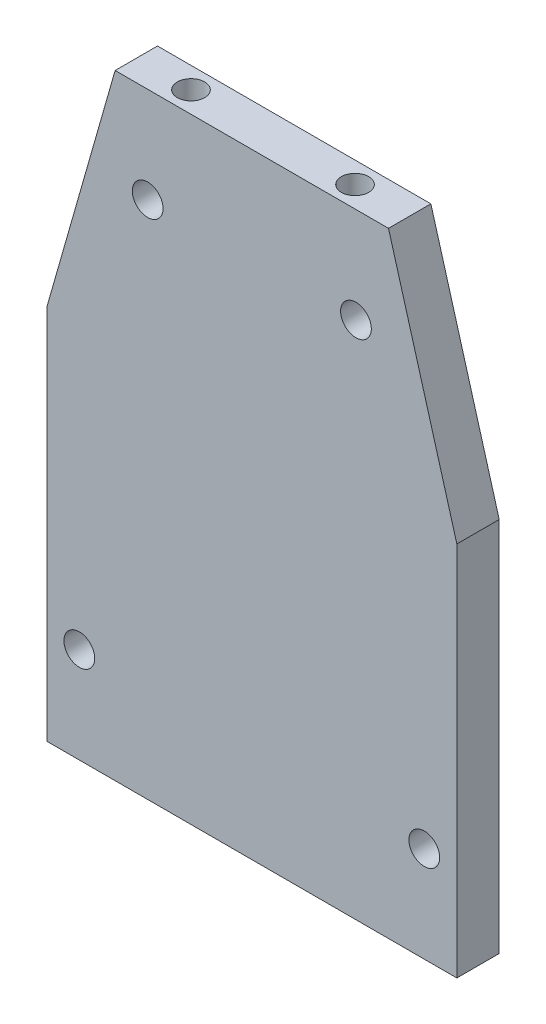
ISO-10303-21;
HEADER;
FILE_DESCRIPTION(('STEP AP214'),'2;1');
FILE_NAME('part.step','',(''),(''),'','','');
FILE_SCHEMA(('AUTOMOTIVE_DESIGN { 1 0 10303 214 1 1 1 1 }'));
ENDSEC;
DATA;
#1=APPLICATION_CONTEXT('core data for automotive mechanical design processes');
#2=APPLICATION_PROTOCOL_DEFINITION('international standard','automotive_design',2000,#1);
#3=PRODUCT_CONTEXT('',#1,'mechanical');
#4=PRODUCT('Part','Part','',(#3));
#5=PRODUCT_RELATED_PRODUCT_CATEGORY('part','',(#4));
#6=PRODUCT_DEFINITION_FORMATION('','',#4);
#7=PRODUCT_DEFINITION_CONTEXT('part definition',#1,'design');
#8=PRODUCT_DEFINITION('design','',#6,#7);
#9=PRODUCT_DEFINITION_SHAPE('','',#8);
#10=(LENGTH_UNIT() NAMED_UNIT(*) SI_UNIT(.MILLI.,.METRE.));
#11=(NAMED_UNIT(*) PLANE_ANGLE_UNIT() SI_UNIT($,.RADIAN.));
#12=(NAMED_UNIT(*) SI_UNIT($,.STERADIAN.) SOLID_ANGLE_UNIT());
#13=UNCERTAINTY_MEASURE_WITH_UNIT(LENGTH_MEASURE(1.E-05),#10,'distance_accuracy_value','');
#14=(GEOMETRIC_REPRESENTATION_CONTEXT(3) GLOBAL_UNCERTAINTY_ASSIGNED_CONTEXT((#13)) GLOBAL_UNIT_ASSIGNED_CONTEXT((#10,
#11,#12)) REPRESENTATION_CONTEXT('',''));
#15=CARTESIAN_POINT('',(0.,0.,0.));
#16=DIRECTION('',(0.,0.,1.));
#17=DIRECTION('',(1.,0.,0.));
#18=AXIS2_PLACEMENT_3D('',#15,#16,#17);
#19=CARTESIAN_POINT('',(-20.,45.,3.1));
#20=DIRECTION('',(0.961523947640823,-0.274721127897378,0.));
#21=DIRECTION('',(0.274721127897378,0.961523947640823,0.));
#22=AXIS2_PLACEMENT_3D('',#19,#20,#21);
#23=PLANE('',#22);
#24=DIRECTION('',(-0.274721127897378,-0.961523947640823,0.));
#25=VECTOR('',#24,1.);
#26=CARTESIAN_POINT('',(-20.,45.,-3.1));
#27=LINE('',#26,#25);
#28=CARTESIAN_POINT('',(-20.,45.,-3.1));
#29=VERTEX_POINT('',#28);
#30=CARTESIAN_POINT('',(-30.,9.99999999999999,-3.1));
#31=VERTEX_POINT('',#30);
#32=EDGE_CURVE('E117',#29,#31,#27,.T.);
#33=ORIENTED_EDGE('',*,*,#32,.T.);
#34=DIRECTION('',(0.,0.,-1.));
#35=VECTOR('',#34,1.);
#36=CARTESIAN_POINT('',(-30.,9.99999999999999,3.1));
#37=LINE('',#36,#35);
#38=CARTESIAN_POINT('',(-30.,9.99999999999999,3.1));
#39=VERTEX_POINT('',#38);
#40=EDGE_CURVE('E11',#39,#31,#37,.T.);
#41=ORIENTED_EDGE('',*,*,#40,.F.);
#42=DIRECTION('',(-0.274721127897378,-0.961523947640823,0.));
#43=VECTOR('',#42,1.);
#44=CARTESIAN_POINT('',(-20.,45.,3.1));
#45=LINE('',#44,#43);
#46=CARTESIAN_POINT('',(-20.,45.,3.1));
#47=VERTEX_POINT('',#46);
#48=EDGE_CURVE('E128',#47,#39,#45,.T.);
#49=ORIENTED_EDGE('',*,*,#48,.F.);
#50=DIRECTION('',(0.,0.,-1.));
#51=VECTOR('',#50,1.);
#52=CARTESIAN_POINT('',(-20.,45.,3.1));
#53=LINE('',#52,#51);
#54=EDGE_CURVE('E113',#47,#29,#53,.T.);
#55=ORIENTED_EDGE('',*,*,#54,.T.);
#56=EDGE_LOOP('',(#33,#41,#49,#55));
#57=FACE_BOUND('',#56,.T.);
#58=ADVANCED_FACE('F33',(#57),#23,.F.);
#59=CARTESIAN_POINT('',(-30.,9.99999999999999,3.1));
#60=DIRECTION('',(1.,0.,0.));
#61=DIRECTION('',(0.,1.,0.));
#62=AXIS2_PLACEMENT_3D('',#59,#60,#61);
#63=PLANE('',#62);
#64=DIRECTION('',(0.,-1.,0.));
#65=VECTOR('',#64,1.);
#66=CARTESIAN_POINT('',(-30.,9.99999999999999,-3.1));
#67=LINE('',#66,#65);
#68=CARTESIAN_POINT('',(-30.,-45.,-3.1));
#69=VERTEX_POINT('',#68);
#70=EDGE_CURVE('E120',#31,#69,#67,.T.);
#71=ORIENTED_EDGE('',*,*,#70,.T.);
#72=DIRECTION('',(0.,0.,-1.));
#73=VECTOR('',#72,1.);
#74=CARTESIAN_POINT('',(-30.,-45.,3.1));
#75=LINE('',#74,#73);
#76=CARTESIAN_POINT('',(-30.,-45.,3.1));
#77=VERTEX_POINT('',#76);
#78=EDGE_CURVE('E41',#77,#69,#75,.T.);
#79=ORIENTED_EDGE('',*,*,#78,.F.);
#80=DIRECTION('',(0.,-1.,0.));
#81=VECTOR('',#80,1.);
#82=CARTESIAN_POINT('',(-30.,9.99999999999999,3.1));
#83=LINE('',#82,#81);
#84=EDGE_CURVE('E86',#39,#77,#83,.T.);
#85=ORIENTED_EDGE('',*,*,#84,.F.);
#86=ORIENTED_EDGE('',*,*,#40,.T.);
#87=EDGE_LOOP('',(#71,#79,#85,#86));
#88=FACE_BOUND('',#87,.T.);
#89=ADVANCED_FACE('F156',(#88),#63,.F.);
#90=CARTESIAN_POINT('',(-30.,-45.,3.1));
#91=DIRECTION('',(0.,1.,0.));
#92=DIRECTION('',(-1.,0.,0.));
#93=AXIS2_PLACEMENT_3D('',#90,#91,#92);
#94=PLANE('',#93);
#95=CARTESIAN_POINT('',(20.,-45.,0.));
#96=DIRECTION('',(0.,-1.,0.));
#97=DIRECTION('',(1.,0.,0.));
#98=AXIS2_PLACEMENT_3D('',#95,#96,#97);
#99=CIRCLE('',#98,2.);
#100=CARTESIAN_POINT('',(22.,-45.,0.));
#101=VERTEX_POINT('',#100);
#102=EDGE_CURVE('E375',#101,#101,#99,.T.);
#103=ORIENTED_EDGE('',*,*,#102,.F.);
#104=EDGE_LOOP('',(#103));
#105=FACE_BOUND('',#104,.T.);
#106=CARTESIAN_POINT('',(-20.,-45.,0.));
#107=DIRECTION('',(0.,-1.,0.));
#108=DIRECTION('',(-1.,0.,0.));
#109=AXIS2_PLACEMENT_3D('',#106,#107,#108);
#110=CIRCLE('',#109,2.);
#111=CARTESIAN_POINT('',(-22.,-45.,0.));
#112=VERTEX_POINT('',#111);
#113=EDGE_CURVE('E381',#112,#112,#110,.T.);
#114=ORIENTED_EDGE('',*,*,#113,.F.);
#115=EDGE_LOOP('',(#114));
#116=FACE_BOUND('',#115,.T.);
#117=CARTESIAN_POINT('',(0.,-45.,0.));
#118=DIRECTION('',(0.,-1.,0.));
#119=DIRECTION('',(1.,0.,0.));
#120=AXIS2_PLACEMENT_3D('',#117,#118,#119);
#121=CIRCLE('',#120,2.);
#122=CARTESIAN_POINT('',(2.,-45.,0.));
#123=VERTEX_POINT('',#122);
#124=EDGE_CURVE('E351',#123,#123,#121,.T.);
#125=ORIENTED_EDGE('',*,*,#124,.F.);
#126=EDGE_LOOP('',(#125));
#127=FACE_BOUND('',#126,.T.);
#128=DIRECTION('',(1.,0.,0.));
#129=VECTOR('',#128,1.);
#130=CARTESIAN_POINT('',(-30.,-45.,-3.1));
#131=LINE('',#130,#129);
#132=CARTESIAN_POINT('',(30.,-45.,-3.1));
#133=VERTEX_POINT('',#132);
#134=EDGE_CURVE('E123',#69,#133,#131,.T.);
#135=ORIENTED_EDGE('',*,*,#134,.T.);
#136=DIRECTION('',(0.,0.,-1.));
#137=VECTOR('',#136,1.);
#138=CARTESIAN_POINT('',(30.,-45.,3.1));
#139=LINE('',#138,#137);
#140=CARTESIAN_POINT('',(30.,-45.,3.1));
#141=VERTEX_POINT('',#140);
#142=EDGE_CURVE('E108',#141,#133,#139,.T.);
#143=ORIENTED_EDGE('',*,*,#142,.F.);
#144=DIRECTION('',(1.,0.,0.));
#145=VECTOR('',#144,1.);
#146=CARTESIAN_POINT('',(-30.,-45.,3.1));
#147=LINE('',#146,#145);
#148=EDGE_CURVE('E99',#77,#141,#147,.T.);
#149=ORIENTED_EDGE('',*,*,#148,.F.);
#150=ORIENTED_EDGE('',*,*,#78,.T.);
#151=EDGE_LOOP('',(#135,#143,#149,#150));
#152=FACE_BOUND('',#151,.T.);
#153=ADVANCED_FACE('F134',(#105,#116,#127,#152),#94,.F.);
#154=CARTESIAN_POINT('',(30.,10.,3.1));
#155=DIRECTION('',(-1.,0.,0.));
#156=DIRECTION('',(0.,-1.,0.));
#157=AXIS2_PLACEMENT_3D('',#154,#155,#156);
#158=PLANE('',#157);
#159=DIRECTION('',(0.,1.,0.));
#160=VECTOR('',#159,1.);
#161=CARTESIAN_POINT('',(30.,10.,-3.1));
#162=LINE('',#161,#160);
#163=CARTESIAN_POINT('',(30.,10.,-3.1));
#164=VERTEX_POINT('',#163);
#165=EDGE_CURVE('E107',#133,#164,#162,.T.);
#166=ORIENTED_EDGE('',*,*,#165,.T.);
#167=DIRECTION('',(0.,0.,-1.));
#168=VECTOR('',#167,1.);
#169=CARTESIAN_POINT('',(30.,10.,3.1));
#170=LINE('',#169,#168);
#171=CARTESIAN_POINT('',(30.,10.,3.1));
#172=VERTEX_POINT('',#171);
#173=EDGE_CURVE('E104',#172,#164,#170,.T.);
#174=ORIENTED_EDGE('',*,*,#173,.F.);
#175=DIRECTION('',(0.,1.,0.));
#176=VECTOR('',#175,1.);
#177=CARTESIAN_POINT('',(30.,10.,3.1));
#178=LINE('',#177,#176);
#179=EDGE_CURVE('E93',#141,#172,#178,.T.);
#180=ORIENTED_EDGE('',*,*,#179,.F.);
#181=ORIENTED_EDGE('',*,*,#142,.T.);
#182=EDGE_LOOP('',(#166,#174,#180,#181));
#183=FACE_BOUND('',#182,.T.);
#184=ADVANCED_FACE('F105',(#183),#158,.F.);
#185=CARTESIAN_POINT('',(20.,45.,3.1));
#186=DIRECTION('',(-0.961523947640823,-0.274721127897379,0.));
#187=DIRECTION('',(0.274721127897379,-0.961523947640823,0.));
#188=AXIS2_PLACEMENT_3D('',#185,#186,#187);
#189=PLANE('',#188);
#190=DIRECTION('',(-0.274721127897379,0.961523947640823,0.));
#191=VECTOR('',#190,1.);
#192=CARTESIAN_POINT('',(20.,45.,-3.1));
#193=LINE('',#192,#191);
#194=CARTESIAN_POINT('',(20.,45.,-3.1));
#195=VERTEX_POINT('',#194);
#196=EDGE_CURVE('E72',#164,#195,#193,.T.);
#197=ORIENTED_EDGE('',*,*,#196,.T.);
#198=DIRECTION('',(0.,0.,-1.));
#199=VECTOR('',#198,1.);
#200=CARTESIAN_POINT('',(20.,45.,3.1));
#201=LINE('',#200,#199);
#202=CARTESIAN_POINT('',(20.,45.,3.1));
#203=VERTEX_POINT('',#202);
#204=EDGE_CURVE('E109',#203,#195,#201,.T.);
#205=ORIENTED_EDGE('',*,*,#204,.F.);
#206=DIRECTION('',(-0.274721127897379,0.961523947640823,0.));
#207=VECTOR('',#206,1.);
#208=CARTESIAN_POINT('',(20.,45.,3.1));
#209=LINE('',#208,#207);
#210=EDGE_CURVE('E97',#172,#203,#209,.T.);
#211=ORIENTED_EDGE('',*,*,#210,.F.);
#212=ORIENTED_EDGE('',*,*,#173,.T.);
#213=EDGE_LOOP('',(#197,#205,#211,#212));
#214=FACE_BOUND('',#213,.T.);
#215=ADVANCED_FACE('F111',(#214),#189,.F.);
#216=CARTESIAN_POINT('',(-20.,45.,3.1));
#217=DIRECTION('',(0.,-1.,0.));
#218=DIRECTION('',(1.,0.,0.));
#219=AXIS2_PLACEMENT_3D('',#216,#217,#218);
#220=PLANE('',#219);
#221=CARTESIAN_POINT('',(-12.,45.,0.));
#222=DIRECTION('',(0.,1.,0.));
#223=DIRECTION('',(-1.,0.,0.));
#224=AXIS2_PLACEMENT_3D('',#221,#222,#223);
#225=CIRCLE('',#224,2.);
#226=CARTESIAN_POINT('',(-14.,45.,0.));
#227=VERTEX_POINT('',#226);
#228=EDGE_CURVE('E391',#227,#227,#225,.T.);
#229=ORIENTED_EDGE('',*,*,#228,.F.);
#230=EDGE_LOOP('',(#229));
#231=FACE_BOUND('',#230,.T.);
#232=CARTESIAN_POINT('',(12.,45.,0.));
#233=DIRECTION('',(0.,1.,0.));
#234=DIRECTION('',(1.,0.,0.));
#235=AXIS2_PLACEMENT_3D('',#232,#233,#234);
#236=CIRCLE('',#235,2.);
#237=CARTESIAN_POINT('',(14.,45.,0.));
#238=VERTEX_POINT('',#237);
#239=EDGE_CURVE('E374',#238,#238,#236,.T.);
#240=ORIENTED_EDGE('',*,*,#239,.F.);
#241=EDGE_LOOP('',(#240));
#242=FACE_BOUND('',#241,.T.);
#243=DIRECTION('',(-1.,0.,0.));
#244=VECTOR('',#243,1.);
#245=CARTESIAN_POINT('',(-20.,45.,-3.1));
#246=LINE('',#245,#244);
#247=EDGE_CURVE('E78',#195,#29,#246,.T.);
#248=ORIENTED_EDGE('',*,*,#247,.T.);
#249=ORIENTED_EDGE('',*,*,#54,.F.);
#250=DIRECTION('',(-1.,0.,0.));
#251=VECTOR('',#250,1.);
#252=CARTESIAN_POINT('',(-20.,45.,3.1));
#253=LINE('',#252,#251);
#254=EDGE_CURVE('E49',#203,#47,#253,.T.);
#255=ORIENTED_EDGE('',*,*,#254,.F.);
#256=ORIENTED_EDGE('',*,*,#204,.T.);
#257=EDGE_LOOP('',(#248,#249,#255,#256));
#258=FACE_BOUND('',#257,.T.);
#259=ADVANCED_FACE('F141',(#231,#242,#258),#220,.F.);
#260=CARTESIAN_POINT('',(0.,0.,3.1));
#261=DIRECTION('',(0.,0.,1.));
#262=DIRECTION('',(1.,0.,0.));
#263=AXIS2_PLACEMENT_3D('',#260,#261,#262);
#264=PLANE('',#263);
#265=CARTESIAN_POINT('',(-25.2375,-31.,3.1));
#266=DIRECTION('',(0.,0.,1.));
#267=DIRECTION('',(1.,0.,0.));
#268=AXIS2_PLACEMENT_3D('',#265,#266,#267);
#269=CIRCLE('',#268,2.25);
#270=CARTESIAN_POINT('',(-22.9875,-31.,3.1));
#271=VERTEX_POINT('',#270);
#272=EDGE_CURVE('E348',#271,#271,#269,.T.);
#273=ORIENTED_EDGE('',*,*,#272,.F.);
#274=EDGE_LOOP('',(#273));
#275=FACE_BOUND('',#274,.T.);
#276=CARTESIAN_POINT('',(15.2374999999996,31.,3.1));
#277=DIRECTION('',(0.,0.,1.));
#278=DIRECTION('',(-1.,0.,0.));
#279=AXIS2_PLACEMENT_3D('',#276,#277,#278);
#280=CIRCLE('',#279,2.25);
#281=CARTESIAN_POINT('',(12.9874999999996,31.,3.1));
#282=VERTEX_POINT('',#281);
#283=EDGE_CURVE('E357',#282,#282,#280,.T.);
#284=ORIENTED_EDGE('',*,*,#283,.F.);
#285=EDGE_LOOP('',(#284));
#286=FACE_BOUND('',#285,.T.);
#287=CARTESIAN_POINT('',(-15.2374999999996,31.,3.1));
#288=DIRECTION('',(0.,0.,1.));
#289=DIRECTION('',(1.,0.,0.));
#290=AXIS2_PLACEMENT_3D('',#287,#288,#289);
#291=CIRCLE('',#290,2.25);
#292=CARTESIAN_POINT('',(-12.9874999999996,31.,3.1));
#293=VERTEX_POINT('',#292);
#294=EDGE_CURVE('E363',#293,#293,#291,.T.);
#295=ORIENTED_EDGE('',*,*,#294,.F.);
#296=EDGE_LOOP('',(#295));
#297=FACE_BOUND('',#296,.T.);
#298=CARTESIAN_POINT('',(25.2375,-31.,3.1));
#299=DIRECTION('',(0.,0.,1.));
#300=DIRECTION('',(-1.,0.,0.));
#301=AXIS2_PLACEMENT_3D('',#298,#299,#300);
#302=CIRCLE('',#301,2.25);
#303=CARTESIAN_POINT('',(22.9875,-31.,3.1));
#304=VERTEX_POINT('',#303);
#305=EDGE_CURVE('E354',#304,#304,#302,.T.);
#306=ORIENTED_EDGE('',*,*,#305,.F.);
#307=EDGE_LOOP('',(#306));
#308=FACE_BOUND('',#307,.T.);
#309=ORIENTED_EDGE('',*,*,#48,.T.);
#310=ORIENTED_EDGE('',*,*,#84,.T.);
#311=ORIENTED_EDGE('',*,*,#148,.T.);
#312=ORIENTED_EDGE('',*,*,#179,.T.);
#313=ORIENTED_EDGE('',*,*,#210,.T.);
#314=ORIENTED_EDGE('',*,*,#254,.T.);
#315=EDGE_LOOP('',(#309,#310,#311,#312,#313,#314));
#316=FACE_BOUND('',#315,.T.);
#317=ADVANCED_FACE('F95',(#275,#286,#297,#308,#316),#264,.T.);
#318=CARTESIAN_POINT('',(0.,0.,-3.1));
#319=DIRECTION('',(0.,0.,1.));
#320=DIRECTION('',(1.,0.,0.));
#321=AXIS2_PLACEMENT_3D('',#318,#319,#320);
#322=PLANE('',#321);
#323=CARTESIAN_POINT('',(-25.2375,-31.,-3.1));
#324=DIRECTION('',(0.,0.,1.));
#325=DIRECTION('',(1.,0.,0.));
#326=AXIS2_PLACEMENT_3D('',#323,#324,#325);
#327=CIRCLE('',#326,2.25);
#328=CARTESIAN_POINT('',(-22.9875,-31.,-3.1));
#329=VERTEX_POINT('',#328);
#330=EDGE_CURVE('E345',#329,#329,#327,.F.);
#331=ORIENTED_EDGE('',*,*,#330,.F.);
#332=EDGE_LOOP('',(#331));
#333=FACE_BOUND('',#332,.T.);
#334=CARTESIAN_POINT('',(15.2374999999996,31.,-3.1));
#335=DIRECTION('',(0.,0.,1.));
#336=DIRECTION('',(1.,0.,0.));
#337=AXIS2_PLACEMENT_3D('',#334,#335,#336);
#338=CIRCLE('',#337,2.25);
#339=CARTESIAN_POINT('',(17.4874999999996,31.,-3.1));
#340=VERTEX_POINT('',#339);
#341=EDGE_CURVE('E360',#340,#340,#338,.F.);
#342=ORIENTED_EDGE('',*,*,#341,.F.);
#343=EDGE_LOOP('',(#342));
#344=FACE_BOUND('',#343,.T.);
#345=CARTESIAN_POINT('',(-15.2374999999996,31.,-3.1));
#346=DIRECTION('',(0.,0.,1.));
#347=DIRECTION('',(1.,0.,0.));
#348=AXIS2_PLACEMENT_3D('',#345,#346,#347);
#349=CIRCLE('',#348,2.25);
#350=CARTESIAN_POINT('',(-12.9874999999996,31.,-3.1));
#351=VERTEX_POINT('',#350);
#352=EDGE_CURVE('E365',#351,#351,#349,.F.);
#353=ORIENTED_EDGE('',*,*,#352,.F.);
#354=EDGE_LOOP('',(#353));
#355=FACE_BOUND('',#354,.T.);
#356=CARTESIAN_POINT('',(25.2375,-31.,-3.1));
#357=DIRECTION('',(0.,0.,1.));
#358=DIRECTION('',(1.,0.,0.));
#359=AXIS2_PLACEMENT_3D('',#356,#357,#358);
#360=CIRCLE('',#359,2.25);
#361=CARTESIAN_POINT('',(27.4875,-31.,-3.1));
#362=VERTEX_POINT('',#361);
#363=EDGE_CURVE('E349',#362,#362,#360,.F.);
#364=ORIENTED_EDGE('',*,*,#363,.F.);
#365=EDGE_LOOP('',(#364));
#366=FACE_BOUND('',#365,.T.);
#367=ORIENTED_EDGE('',*,*,#32,.F.);
#368=ORIENTED_EDGE('',*,*,#247,.F.);
#369=ORIENTED_EDGE('',*,*,#196,.F.);
#370=ORIENTED_EDGE('',*,*,#165,.F.);
#371=ORIENTED_EDGE('',*,*,#134,.F.);
#372=ORIENTED_EDGE('',*,*,#70,.F.);
#373=EDGE_LOOP('',(#367,#368,#369,#370,#371,#372));
#374=FACE_BOUND('',#373,.T.);
#375=ADVANCED_FACE('F137',(#333,#344,#355,#366,#374),#322,.F.);
#376=CARTESIAN_POINT('',(12.,37.,0.));
#377=DIRECTION('',(0.,1.,0.));
#378=DIRECTION('',(-1.,0.,0.));
#379=AXIS2_PLACEMENT_3D('',#376,#377,#378);
#380=CYLINDRICAL_SURFACE('',#379,2.);
#381=CARTESIAN_POINT('',(12.,37.,0.));
#382=DIRECTION('',(0.,1.,0.));
#383=DIRECTION('',(1.,0.,0.));
#384=AXIS2_PLACEMENT_3D('',#381,#382,#383);
#385=CIRCLE('',#384,2.);
#386=CARTESIAN_POINT('',(14.,37.,0.));
#387=VERTEX_POINT('',#386);
#388=EDGE_CURVE('E394',#387,#387,#385,.T.);
#389=ORIENTED_EDGE('',*,*,#388,.F.);
#390=EDGE_LOOP('',(#389));
#391=FACE_BOUND('',#390,.T.);
#392=ORIENTED_EDGE('',*,*,#239,.T.);
#393=EDGE_LOOP('',(#392));
#394=FACE_BOUND('',#393,.T.);
#395=ADVANCED_FACE('F185',(#391,#394),#380,.F.);
#396=CARTESIAN_POINT('',(12.,37.,0.));
#397=DIRECTION('',(0.,-1.,0.));
#398=DIRECTION('',(1.,0.,0.));
#399=AXIS2_PLACEMENT_3D('',#396,#397,#398);
#400=PLANE('',#399);
#401=ORIENTED_EDGE('',*,*,#388,.T.);
#402=EDGE_LOOP('',(#401));
#403=FACE_BOUND('',#402,.T.);
#404=ADVANCED_FACE('F190',(#403),#400,.F.);
#405=CARTESIAN_POINT('',(-12.,37.,0.));
#406=DIRECTION('',(0.,1.,0.));
#407=DIRECTION('',(-1.,0.,0.));
#408=AXIS2_PLACEMENT_3D('',#405,#406,#407);
#409=CYLINDRICAL_SURFACE('',#408,2.);
#410=CARTESIAN_POINT('',(-12.,37.,0.));
#411=DIRECTION('',(0.,1.,0.));
#412=DIRECTION('',(-1.,0.,0.));
#413=AXIS2_PLACEMENT_3D('',#410,#411,#412);
#414=CIRCLE('',#413,2.);
#415=CARTESIAN_POINT('',(-14.,37.,0.));
#416=VERTEX_POINT('',#415);
#417=EDGE_CURVE('E121',#416,#416,#414,.T.);
#418=ORIENTED_EDGE('',*,*,#417,.F.);
#419=EDGE_LOOP('',(#418));
#420=FACE_BOUND('',#419,.T.);
#421=ORIENTED_EDGE('',*,*,#228,.T.);
#422=EDGE_LOOP('',(#421));
#423=FACE_BOUND('',#422,.T.);
#424=ADVANCED_FACE('F202',(#420,#423),#409,.F.);
#425=CARTESIAN_POINT('',(-12.,37.,0.));
#426=DIRECTION('',(0.,1.,0.));
#427=DIRECTION('',(-1.,0.,0.));
#428=AXIS2_PLACEMENT_3D('',#425,#426,#427);
#429=PLANE('',#428);
#430=ORIENTED_EDGE('',*,*,#417,.T.);
#431=EDGE_LOOP('',(#430));
#432=FACE_BOUND('',#431,.T.);
#433=ADVANCED_FACE('F212',(#432),#429,.T.);
#434=CARTESIAN_POINT('',(0.,-37.,0.));
#435=DIRECTION('',(0.,-1.,0.));
#436=DIRECTION('',(1.,0.,0.));
#437=AXIS2_PLACEMENT_3D('',#434,#435,#436);
#438=CYLINDRICAL_SURFACE('',#437,2.);
#439=CARTESIAN_POINT('',(0.,-37.,0.));
#440=DIRECTION('',(0.,-1.,0.));
#441=DIRECTION('',(1.,0.,0.));
#442=AXIS2_PLACEMENT_3D('',#439,#440,#441);
#443=CIRCLE('',#442,2.);
#444=CARTESIAN_POINT('',(2.,-37.,0.));
#445=VERTEX_POINT('',#444);
#446=EDGE_CURVE('E384',#445,#445,#443,.T.);
#447=ORIENTED_EDGE('',*,*,#446,.F.);
#448=EDGE_LOOP('',(#447));
#449=FACE_BOUND('',#448,.T.);
#450=ORIENTED_EDGE('',*,*,#124,.T.);
#451=EDGE_LOOP('',(#450));
#452=FACE_BOUND('',#451,.T.);
#453=ADVANCED_FACE('F221',(#449,#452),#438,.F.);
#454=CARTESIAN_POINT('',(0.,-37.,0.));
#455=DIRECTION('',(0.,-1.,0.));
#456=DIRECTION('',(1.,0.,0.));
#457=AXIS2_PLACEMENT_3D('',#454,#455,#456);
#458=PLANE('',#457);
#459=ORIENTED_EDGE('',*,*,#446,.T.);
#460=EDGE_LOOP('',(#459));
#461=FACE_BOUND('',#460,.T.);
#462=ADVANCED_FACE('F237',(#461),#458,.T.);
#463=CARTESIAN_POINT('',(-20.,-37.,0.));
#464=DIRECTION('',(0.,-1.,0.));
#465=DIRECTION('',(1.,0.,0.));
#466=AXIS2_PLACEMENT_3D('',#463,#464,#465);
#467=CYLINDRICAL_SURFACE('',#466,2.);
#468=CARTESIAN_POINT('',(-20.,-37.,0.));
#469=DIRECTION('',(0.,-1.,0.));
#470=DIRECTION('',(-1.,0.,0.));
#471=AXIS2_PLACEMENT_3D('',#468,#469,#470);
#472=CIRCLE('',#471,2.);
#473=CARTESIAN_POINT('',(-22.,-37.,0.));
#474=VERTEX_POINT('',#473);
#475=EDGE_CURVE('E378',#474,#474,#472,.T.);
#476=ORIENTED_EDGE('',*,*,#475,.F.);
#477=EDGE_LOOP('',(#476));
#478=FACE_BOUND('',#477,.T.);
#479=ORIENTED_EDGE('',*,*,#113,.T.);
#480=EDGE_LOOP('',(#479));
#481=FACE_BOUND('',#480,.T.);
#482=ADVANCED_FACE('F247',(#478,#481),#467,.F.);
#483=CARTESIAN_POINT('',(-20.,-37.,0.));
#484=DIRECTION('',(0.,1.,0.));
#485=DIRECTION('',(-1.,0.,0.));
#486=AXIS2_PLACEMENT_3D('',#483,#484,#485);
#487=PLANE('',#486);
#488=ORIENTED_EDGE('',*,*,#475,.T.);
#489=EDGE_LOOP('',(#488));
#490=FACE_BOUND('',#489,.T.);
#491=ADVANCED_FACE('F257',(#490),#487,.F.);
#492=CARTESIAN_POINT('',(20.,-37.,0.));
#493=DIRECTION('',(0.,-1.,0.));
#494=DIRECTION('',(1.,0.,0.));
#495=AXIS2_PLACEMENT_3D('',#492,#493,#494);
#496=CYLINDRICAL_SURFACE('',#495,2.);
#497=CARTESIAN_POINT('',(20.,-37.,0.));
#498=DIRECTION('',(0.,-1.,0.));
#499=DIRECTION('',(1.,0.,0.));
#500=AXIS2_PLACEMENT_3D('',#497,#498,#499);
#501=CIRCLE('',#500,2.);
#502=CARTESIAN_POINT('',(22.,-37.,0.));
#503=VERTEX_POINT('',#502);
#504=EDGE_CURVE('E371',#503,#503,#501,.T.);
#505=ORIENTED_EDGE('',*,*,#504,.F.);
#506=EDGE_LOOP('',(#505));
#507=FACE_BOUND('',#506,.T.);
#508=ORIENTED_EDGE('',*,*,#102,.T.);
#509=EDGE_LOOP('',(#508));
#510=FACE_BOUND('',#509,.T.);
#511=ADVANCED_FACE('F267',(#507,#510),#496,.F.);
#512=CARTESIAN_POINT('',(20.,-37.,0.));
#513=DIRECTION('',(0.,-1.,0.));
#514=DIRECTION('',(1.,0.,0.));
#515=AXIS2_PLACEMENT_3D('',#512,#513,#514);
#516=PLANE('',#515);
#517=ORIENTED_EDGE('',*,*,#504,.T.);
#518=EDGE_LOOP('',(#517));
#519=FACE_BOUND('',#518,.T.);
#520=ADVANCED_FACE('F277',(#519),#516,.T.);
#521=CARTESIAN_POINT('',(25.2375,-31.,-9.46396103067893));
#522=DIRECTION('',(0.,0.,1.));
#523=DIRECTION('',(1.,0.,0.));
#524=AXIS2_PLACEMENT_3D('',#521,#522,#523);
#525=CYLINDRICAL_SURFACE('',#524,2.25);
#526=ORIENTED_EDGE('',*,*,#363,.T.);
#527=EDGE_LOOP('',(#526));
#528=FACE_BOUND('',#527,.T.);
#529=ORIENTED_EDGE('',*,*,#305,.T.);
#530=EDGE_LOOP('',(#529));
#531=FACE_BOUND('',#530,.T.);
#532=ADVANCED_FACE('F287',(#528,#531),#525,.F.);
#533=CARTESIAN_POINT('',(-15.2374999999996,31.,-9.46396103067893));
#534=DIRECTION('',(0.,0.,1.));
#535=DIRECTION('',(1.,0.,0.));
#536=AXIS2_PLACEMENT_3D('',#533,#534,#535);
#537=CYLINDRICAL_SURFACE('',#536,2.25);
#538=ORIENTED_EDGE('',*,*,#352,.T.);
#539=EDGE_LOOP('',(#538));
#540=FACE_BOUND('',#539,.T.);
#541=ORIENTED_EDGE('',*,*,#294,.T.);
#542=EDGE_LOOP('',(#541));
#543=FACE_BOUND('',#542,.T.);
#544=ADVANCED_FACE('F308',(#540,#543),#537,.F.);
#545=CARTESIAN_POINT('',(15.2374999999996,31.,-9.46396103067893));
#546=DIRECTION('',(0.,0.,1.));
#547=DIRECTION('',(1.,0.,0.));
#548=AXIS2_PLACEMENT_3D('',#545,#546,#547);
#549=CYLINDRICAL_SURFACE('',#548,2.25);
#550=ORIENTED_EDGE('',*,*,#341,.T.);
#551=EDGE_LOOP('',(#550));
#552=FACE_BOUND('',#551,.T.);
#553=ORIENTED_EDGE('',*,*,#283,.T.);
#554=EDGE_LOOP('',(#553));
#555=FACE_BOUND('',#554,.T.);
#556=ADVANCED_FACE('F318',(#552,#555),#549,.F.);
#557=CARTESIAN_POINT('',(-25.2375,-31.,-9.46396103067893));
#558=DIRECTION('',(0.,0.,1.));
#559=DIRECTION('',(1.,0.,0.));
#560=AXIS2_PLACEMENT_3D('',#557,#558,#559);
#561=CYLINDRICAL_SURFACE('',#560,2.25);
#562=ORIENTED_EDGE('',*,*,#330,.T.);
#563=EDGE_LOOP('',(#562));
#564=FACE_BOUND('',#563,.T.);
#565=ORIENTED_EDGE('',*,*,#272,.T.);
#566=EDGE_LOOP('',(#565));
#567=FACE_BOUND('',#566,.T.);
#568=ADVANCED_FACE('F328',(#564,#567),#561,.F.);
#569=CLOSED_SHELL('',(#58,#89,#153,#184,#215,#259,#317,#375,#395,#404,#424,#433,#453,#462,#482,
#491,#511,#520,#532,#544,#556,#568));
#570=MANIFOLD_SOLID_BREP('B2',#569);
#571=ADVANCED_BREP_SHAPE_REPRESENTATION('',(#18,#570),#14);
#572=SHAPE_DEFINITION_REPRESENTATION(#9,#571);
ENDSEC;
END-ISO-10303-21;
